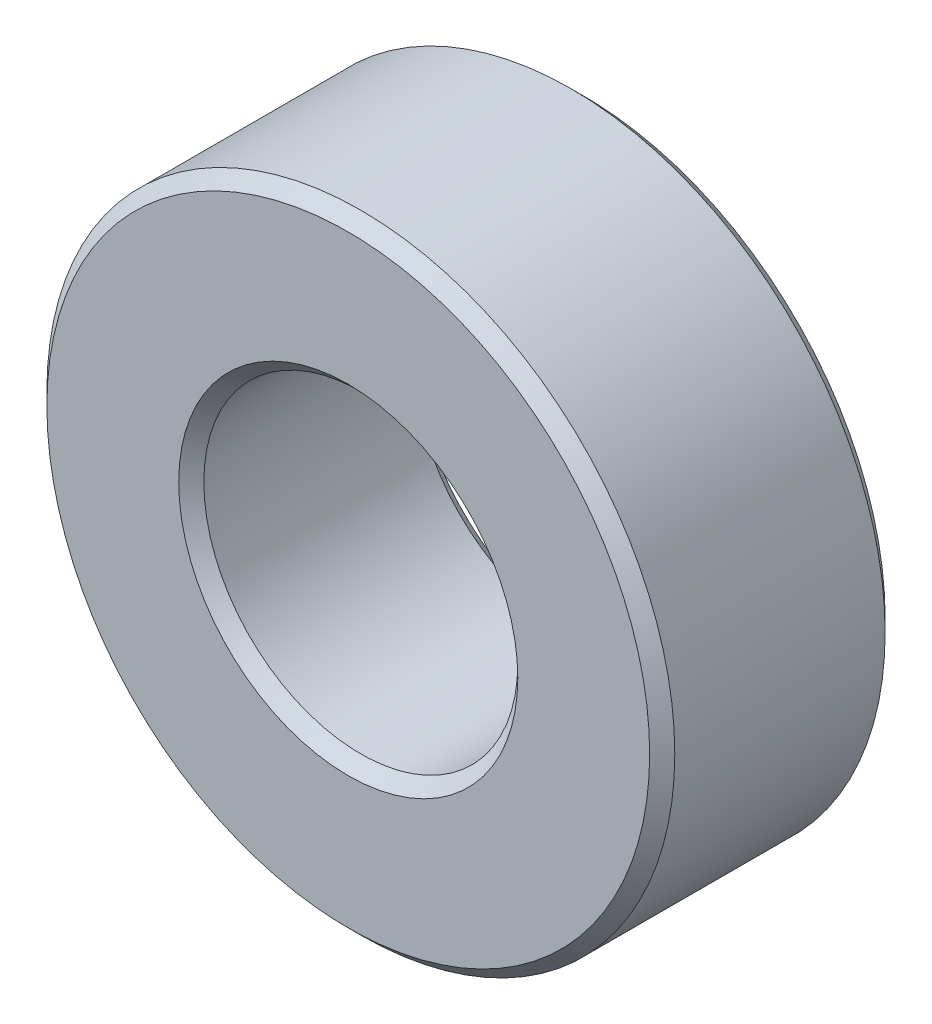
ISO-10303-21;
HEADER;
FILE_DESCRIPTION(('STEP AP214'),'2;1');
FILE_NAME('part.step','',(''),(''),'','','');
FILE_SCHEMA(('AUTOMOTIVE_DESIGN { 1 0 10303 214 1 1 1 1 }'));
ENDSEC;
DATA;
#1=APPLICATION_CONTEXT('core data for automotive mechanical design processes');
#2=APPLICATION_PROTOCOL_DEFINITION('international standard','automotive_design',2000,#1);
#3=PRODUCT_CONTEXT('',#1,'mechanical');
#4=PRODUCT('Part','Part','',(#3));
#5=PRODUCT_RELATED_PRODUCT_CATEGORY('part','',(#4));
#6=PRODUCT_DEFINITION_FORMATION('','',#4);
#7=PRODUCT_DEFINITION_CONTEXT('part definition',#1,'design');
#8=PRODUCT_DEFINITION('design','',#6,#7);
#9=PRODUCT_DEFINITION_SHAPE('','',#8);
#10=(LENGTH_UNIT() NAMED_UNIT(*) SI_UNIT(.MILLI.,.METRE.));
#11=(NAMED_UNIT(*) PLANE_ANGLE_UNIT() SI_UNIT($,.RADIAN.));
#12=(NAMED_UNIT(*) SI_UNIT($,.STERADIAN.) SOLID_ANGLE_UNIT());
#13=UNCERTAINTY_MEASURE_WITH_UNIT(LENGTH_MEASURE(1.E-05),#10,'distance_accuracy_value','');
#14=(GEOMETRIC_REPRESENTATION_CONTEXT(3) GLOBAL_UNCERTAINTY_ASSIGNED_CONTEXT((#13)) GLOBAL_UNIT_ASSIGNED_CONTEXT((#10,
#11,#12)) REPRESENTATION_CONTEXT('',''));
#15=CARTESIAN_POINT('',(0.,0.,0.));
#16=DIRECTION('',(0.,0.,1.));
#17=DIRECTION('',(1.,0.,0.));
#18=AXIS2_PLACEMENT_3D('',#15,#16,#17);
#19=CARTESIAN_POINT('',(0.,0.,4.7625));
#20=DIRECTION('',(0.,0.,1.));
#21=DIRECTION('',(1.,0.,0.));
#22=AXIS2_PLACEMENT_3D('',#19,#20,#21);
#23=PLANE('',#22);
#24=CARTESIAN_POINT('',(0.,0.,4.7625));
#25=DIRECTION('',(0.,0.,1.));
#26=DIRECTION('',(1.,0.,0.));
#27=AXIS2_PLACEMENT_3D('',#24,#25,#26);
#28=CIRCLE('',#27,3.42900000000001);
#29=CARTESIAN_POINT('',(3.42900000000001,0.,4.7625));
#30=VERTEX_POINT('',#29);
#31=EDGE_CURVE('E50',#30,#30,#28,.F.);
#32=ORIENTED_EDGE('',*,*,#31,.T.);
#33=EDGE_LOOP('',(#32));
#34=FACE_BOUND('',#33,.T.);
#35=CARTESIAN_POINT('',(0.,0.,4.7625));
#36=DIRECTION('',(0.,0.,1.));
#37=DIRECTION('',(1.,0.,0.));
#38=AXIS2_PLACEMENT_3D('',#35,#36,#37);
#39=CIRCLE('',#38,6.09600000000001);
#40=CARTESIAN_POINT('',(6.09600000000001,0.,4.7625));
#41=VERTEX_POINT('',#40);
#42=EDGE_CURVE('E54',#41,#41,#39,.T.);
#43=ORIENTED_EDGE('',*,*,#42,.T.);
#44=EDGE_LOOP('',(#43));
#45=FACE_BOUND('',#44,.T.);
#46=ADVANCED_FACE('F38',(#34,#45),#23,.T.);
#47=CARTESIAN_POINT('',(0.,0.,0.));
#48=DIRECTION('',(0.,0.,1.));
#49=DIRECTION('',(1.,0.,0.));
#50=AXIS2_PLACEMENT_3D('',#47,#48,#49);
#51=PLANE('',#50);
#52=CARTESIAN_POINT('',(0.,0.,0.));
#53=DIRECTION('',(0.,0.,1.));
#54=DIRECTION('',(1.,0.,0.));
#55=AXIS2_PLACEMENT_3D('',#52,#53,#54);
#56=CIRCLE('',#55,3.429);
#57=CARTESIAN_POINT('',(3.429,0.,0.));
#58=VERTEX_POINT('',#57);
#59=EDGE_CURVE('E65',#58,#58,#56,.T.);
#60=ORIENTED_EDGE('',*,*,#59,.T.);
#61=EDGE_LOOP('',(#60));
#62=FACE_BOUND('',#61,.T.);
#63=CARTESIAN_POINT('',(0.,0.,0.));
#64=DIRECTION('',(0.,0.,1.));
#65=DIRECTION('',(1.,0.,0.));
#66=AXIS2_PLACEMENT_3D('',#63,#64,#65);
#67=CIRCLE('',#66,6.09599999999999);
#68=CARTESIAN_POINT('',(6.09599999999999,0.,0.));
#69=VERTEX_POINT('',#68);
#70=EDGE_CURVE('E68',#69,#69,#67,.F.);
#71=ORIENTED_EDGE('',*,*,#70,.T.);
#72=EDGE_LOOP('',(#71));
#73=FACE_BOUND('',#72,.T.);
#74=ADVANCED_FACE('F72',(#62,#73),#51,.F.);
#75=CARTESIAN_POINT('',(0.,0.,4.7625));
#76=DIRECTION('',(0.,0.,-1.));
#77=DIRECTION('',(-1.,0.,0.));
#78=AXIS2_PLACEMENT_3D('',#75,#76,#77);
#79=CYLINDRICAL_SURFACE('',#78,6.35);
#80=CARTESIAN_POINT('',(0.,0.,0.254000000000012));
#81=DIRECTION('',(0.,0.,1.));
#82=DIRECTION('',(1.,0.,0.));
#83=AXIS2_PLACEMENT_3D('',#80,#81,#82);
#84=CIRCLE('',#83,6.35);
#85=CARTESIAN_POINT('',(-6.35,0.,0.254000000000011));
#86=VERTEX_POINT('',#85);
#87=EDGE_CURVE('E10',#86,#86,#84,.T.);
#88=CARTESIAN_POINT('',(0.,0.,4.50850000000001));
#89=DIRECTION('',(0.,0.,1.));
#90=DIRECTION('',(1.,0.,0.));
#91=AXIS2_PLACEMENT_3D('',#88,#89,#90);
#92=CIRCLE('',#91,6.35);
#93=CARTESIAN_POINT('',(-6.35,0.,4.50850000000001));
#94=VERTEX_POINT('',#93);
#95=EDGE_CURVE('E46',#94,#94,#92,.F.);
#96=CARTESIAN_POINT('',(-6.35,0.,0.254000000000011));
#97=CARTESIAN_POINT('',(-6.35,0.,0.298317708333344));
#98=CARTESIAN_POINT('',(-6.35,0.,0.342635416666678));
#99=CARTESIAN_POINT('',(-6.35,0.,0.431270833333344));
#100=CARTESIAN_POINT('',(-6.35,0.,0.475588541666678));
#101=CARTESIAN_POINT('',(-6.35,0.,0.564223958333344));
#102=CARTESIAN_POINT('',(-6.35,0.,0.608541666666678));
#103=CARTESIAN_POINT('',(-6.35,0.,0.697177083333345));
#104=CARTESIAN_POINT('',(-6.35,0.,0.741494791666678));
#105=CARTESIAN_POINT('',(-6.35,0.,0.830130208333344));
#106=CARTESIAN_POINT('',(-6.35,0.,0.874447916666678));
#107=CARTESIAN_POINT('',(-6.35,0.,0.963083333333344));
#108=CARTESIAN_POINT('',(-6.35,0.,1.00740104166668));
#109=CARTESIAN_POINT('',(-6.35,0.,1.09603645833334));
#110=CARTESIAN_POINT('',(-6.35,0.,1.14035416666668));
#111=CARTESIAN_POINT('',(-6.35,0.,1.22898958333334));
#112=CARTESIAN_POINT('',(-6.35,0.,1.27330729166668));
#113=CARTESIAN_POINT('',(-6.35,0.,1.36194270833334));
#114=CARTESIAN_POINT('',(-6.35,0.,1.40626041666668));
#115=CARTESIAN_POINT('',(-6.35,0.,1.49489583333334));
#116=CARTESIAN_POINT('',(-6.35,0.,1.53921354166668));
#117=CARTESIAN_POINT('',(-6.35,0.,1.62784895833334));
#118=CARTESIAN_POINT('',(-6.35,0.,1.67216666666668));
#119=CARTESIAN_POINT('',(-6.35,0.,1.76080208333334));
#120=CARTESIAN_POINT('',(-6.35,0.,1.80511979166668));
#121=CARTESIAN_POINT('',(-6.35,0.,1.89375520833334));
#122=CARTESIAN_POINT('',(-6.35,0.,1.93807291666668));
#123=CARTESIAN_POINT('',(-6.35,0.,2.02670833333334));
#124=CARTESIAN_POINT('',(-6.35,0.,2.07102604166668));
#125=CARTESIAN_POINT('',(-6.35,0.,2.15966145833334));
#126=CARTESIAN_POINT('',(-6.35,0.,2.20397916666668));
#127=CARTESIAN_POINT('',(-6.35,0.,2.29261458333334));
#128=CARTESIAN_POINT('',(-6.35,0.,2.33693229166668));
#129=CARTESIAN_POINT('',(-6.35,0.,2.42556770833334));
#130=CARTESIAN_POINT('',(-6.35,0.,2.46988541666668));
#131=CARTESIAN_POINT('',(-6.35,0.,2.55852083333334));
#132=CARTESIAN_POINT('',(-6.35,0.,2.60283854166668));
#133=CARTESIAN_POINT('',(-6.35,0.,2.69147395833334));
#134=CARTESIAN_POINT('',(-6.35,0.,2.73579166666668));
#135=CARTESIAN_POINT('',(-6.35,0.,2.82442708333334));
#136=CARTESIAN_POINT('',(-6.35,0.,2.86874479166668));
#137=CARTESIAN_POINT('',(-6.35,0.,2.95738020833334));
#138=CARTESIAN_POINT('',(-6.35,0.,3.00169791666668));
#139=CARTESIAN_POINT('',(-6.35,0.,3.09033333333334));
#140=CARTESIAN_POINT('',(-6.35,0.,3.13465104166668));
#141=CARTESIAN_POINT('',(-6.35,0.,3.22328645833334));
#142=CARTESIAN_POINT('',(-6.35,0.,3.26760416666668));
#143=CARTESIAN_POINT('',(-6.35,0.,3.35623958333334));
#144=CARTESIAN_POINT('',(-6.35,0.,3.40055729166668));
#145=CARTESIAN_POINT('',(-6.35,0.,3.48919270833334));
#146=CARTESIAN_POINT('',(-6.35,0.,3.53351041666668));
#147=CARTESIAN_POINT('',(-6.35,0.,3.62214583333334));
#148=CARTESIAN_POINT('',(-6.35,0.,3.66646354166668));
#149=CARTESIAN_POINT('',(-6.35,0.,3.75509895833334));
#150=CARTESIAN_POINT('',(-6.35,0.,3.79941666666668));
#151=CARTESIAN_POINT('',(-6.35,0.,3.88805208333334));
#152=CARTESIAN_POINT('',(-6.35,0.,3.93236979166668));
#153=CARTESIAN_POINT('',(-6.35,0.,4.02100520833334));
#154=CARTESIAN_POINT('',(-6.35,0.,4.06532291666668));
#155=CARTESIAN_POINT('',(-6.35,0.,4.15395833333334));
#156=CARTESIAN_POINT('',(-6.35,0.,4.19827604166668));
#157=CARTESIAN_POINT('',(-6.35,0.,4.28691145833334));
#158=CARTESIAN_POINT('',(-6.35,0.,4.33122916666668));
#159=CARTESIAN_POINT('',(-6.35,0.,4.41986458333334));
#160=CARTESIAN_POINT('',(-6.35,0.,4.46418229166668));
#161=CARTESIAN_POINT('',(-6.35,0.,4.50850000000001));
#162=B_SPLINE_CURVE_WITH_KNOTS('',3,(#96,#97,#98,#99,#100,#101,#102,#103,#104,#105,#106,#107,
#108,#109,#110,#111,#112,#113,#114,#115,#116,#117,#118,#119,#120,#121,#122,#123,#124,#125,#126,
#127,#128,#129,#130,#131,#132,#133,#134,#135,#136,#137,#138,#139,#140,#141,#142,#143,#144,#145,
#146,#147,#148,#149,#150,#151,#152,#153,#154,#155,#156,#157,#158,#159,#160,#161),.UNSPECIFIED.,
.F.,.F.,(4,2,2,2,2,2,2,2,2,2,2,2,2,2,2,2,2,2,2,2,2,2,2,2,2,2,2,2,2,2,2,2,4),(0.,0.132953125,
0.26590625,0.398859375,0.5318125,0.664765625,0.797718749999999,0.930671874999999,1.063625,
1.196578125,1.32953125,1.462484375,1.5954375,1.728390625,1.86134375,1.994296875,2.12725,
2.260203125,2.39315625,2.526109375,2.6590625,2.792015625,2.92496875,3.057921875,3.190875,
3.323828125,3.45678125,3.589734375,3.7226875,3.855640625,3.98859375,4.121546875,4.2545),.UNSPECIFIED.);
#163=EDGE_CURVE('BSEAM93',#86,#94,#162,.T.);
#164=ORIENTED_EDGE('',*,*,#87,.T.);
#165=ORIENTED_EDGE('',*,*,#95,.T.);
#166=ORIENTED_EDGE('',*,*,#163,.T.);
#167=ORIENTED_EDGE('',*,*,#163,.F.);
#168=EDGE_LOOP('',(#164,#166,#165,#167));
#169=FACE_BOUND('',#168,.T.);
#170=ADVANCED_FACE('F93',(#169),#79,.T.);
#171=CARTESIAN_POINT('',(0.,0.,4.7625));
#172=DIRECTION('',(0.,0.,-1.));
#173=DIRECTION('',(-1.,0.,0.));
#174=AXIS2_PLACEMENT_3D('',#171,#172,#173);
#175=CYLINDRICAL_SURFACE('',#174,3.175);
#176=CARTESIAN_POINT('',(0.,0.,0.253999999999996));
#177=DIRECTION('',(0.,0.,1.));
#178=DIRECTION('',(1.,0.,0.));
#179=AXIS2_PLACEMENT_3D('',#176,#177,#178);
#180=CIRCLE('',#179,3.175);
#181=CARTESIAN_POINT('',(-3.175,0.,0.253999999999996));
#182=VERTEX_POINT('',#181);
#183=EDGE_CURVE('E59',#182,#182,#180,.F.);
#184=CARTESIAN_POINT('',(0.,0.,4.50849999999999));
#185=DIRECTION('',(0.,0.,1.));
#186=DIRECTION('',(1.,0.,0.));
#187=AXIS2_PLACEMENT_3D('',#184,#185,#186);
#188=CIRCLE('',#187,3.175);
#189=CARTESIAN_POINT('',(-3.175,0.,4.50849999999999));
#190=VERTEX_POINT('',#189);
#191=EDGE_CURVE('E62',#190,#190,#188,.T.);
#192=CARTESIAN_POINT('',(-3.175,0.,0.253999999999996));
#193=CARTESIAN_POINT('',(-3.175,0.,0.298317708333329));
#194=CARTESIAN_POINT('',(-3.175,0.,0.342635416666662));
#195=CARTESIAN_POINT('',(-3.175,0.,0.431270833333329));
#196=CARTESIAN_POINT('',(-3.175,0.,0.475588541666662));
#197=CARTESIAN_POINT('',(-3.175,0.,0.564223958333329));
#198=CARTESIAN_POINT('',(-3.175,0.,0.608541666666662));
#199=CARTESIAN_POINT('',(-3.175,0.,0.697177083333328));
#200=CARTESIAN_POINT('',(-3.175,0.,0.741494791666662));
#201=CARTESIAN_POINT('',(-3.175,0.,0.830130208333328));
#202=CARTESIAN_POINT('',(-3.175,0.,0.874447916666661));
#203=CARTESIAN_POINT('',(-3.175,0.,0.963083333333327));
#204=CARTESIAN_POINT('',(-3.175,0.,1.00740104166666));
#205=CARTESIAN_POINT('',(-3.175,0.,1.09603645833333));
#206=CARTESIAN_POINT('',(-3.175,0.,1.14035416666666));
#207=CARTESIAN_POINT('',(-3.175,0.,1.22898958333333));
#208=CARTESIAN_POINT('',(-3.175,0.,1.27330729166666));
#209=CARTESIAN_POINT('',(-3.175,0.,1.36194270833333));
#210=CARTESIAN_POINT('',(-3.175,0.,1.40626041666666));
#211=CARTESIAN_POINT('',(-3.175,0.,1.49489583333333));
#212=CARTESIAN_POINT('',(-3.175,0.,1.53921354166666));
#213=CARTESIAN_POINT('',(-3.175,0.,1.62784895833333));
#214=CARTESIAN_POINT('',(-3.175,0.,1.67216666666666));
#215=CARTESIAN_POINT('',(-3.175,0.,1.76080208333333));
#216=CARTESIAN_POINT('',(-3.175,0.,1.80511979166666));
#217=CARTESIAN_POINT('',(-3.175,0.,1.89375520833333));
#218=CARTESIAN_POINT('',(-3.175,0.,1.93807291666666));
#219=CARTESIAN_POINT('',(-3.175,0.,2.02670833333333));
#220=CARTESIAN_POINT('',(-3.175,0.,2.07102604166666));
#221=CARTESIAN_POINT('',(-3.175,0.,2.15966145833332));
#222=CARTESIAN_POINT('',(-3.175,0.,2.20397916666666));
#223=CARTESIAN_POINT('',(-3.175,0.,2.29261458333332));
#224=CARTESIAN_POINT('',(-3.175,0.,2.33693229166666));
#225=CARTESIAN_POINT('',(-3.175,0.,2.42556770833332));
#226=CARTESIAN_POINT('',(-3.175,0.,2.46988541666666));
#227=CARTESIAN_POINT('',(-3.175,0.,2.55852083333332));
#228=CARTESIAN_POINT('',(-3.175,0.,2.60283854166666));
#229=CARTESIAN_POINT('',(-3.175,0.,2.69147395833332));
#230=CARTESIAN_POINT('',(-3.175,0.,2.73579166666666));
#231=CARTESIAN_POINT('',(-3.175,0.,2.82442708333332));
#232=CARTESIAN_POINT('',(-3.175,0.,2.86874479166666));
#233=CARTESIAN_POINT('',(-3.175,0.,2.95738020833332));
#234=CARTESIAN_POINT('',(-3.175,0.,3.00169791666666));
#235=CARTESIAN_POINT('',(-3.175,0.,3.09033333333332));
#236=CARTESIAN_POINT('',(-3.175,0.,3.13465104166666));
#237=CARTESIAN_POINT('',(-3.175,0.,3.22328645833332));
#238=CARTESIAN_POINT('',(-3.175,0.,3.26760416666666));
#239=CARTESIAN_POINT('',(-3.175,0.,3.35623958333332));
#240=CARTESIAN_POINT('',(-3.175,0.,3.40055729166666));
#241=CARTESIAN_POINT('',(-3.175,0.,3.48919270833332));
#242=CARTESIAN_POINT('',(-3.175,0.,3.53351041666666));
#243=CARTESIAN_POINT('',(-3.175,0.,3.62214583333332));
#244=CARTESIAN_POINT('',(-3.175,0.,3.66646354166666));
#245=CARTESIAN_POINT('',(-3.175,0.,3.75509895833332));
#246=CARTESIAN_POINT('',(-3.175,0.,3.79941666666666));
#247=CARTESIAN_POINT('',(-3.175,0.,3.88805208333332));
#248=CARTESIAN_POINT('',(-3.175,0.,3.93236979166665));
#249=CARTESIAN_POINT('',(-3.175,0.,4.02100520833332));
#250=CARTESIAN_POINT('',(-3.175,0.,4.06532291666665));
#251=CARTESIAN_POINT('',(-3.175,0.,4.15395833333332));
#252=CARTESIAN_POINT('',(-3.175,0.,4.19827604166665));
#253=CARTESIAN_POINT('',(-3.175,0.,4.28691145833332));
#254=CARTESIAN_POINT('',(-3.175,0.,4.33122916666665));
#255=CARTESIAN_POINT('',(-3.175,0.,4.41986458333332));
#256=CARTESIAN_POINT('',(-3.175,0.,4.46418229166665));
#257=CARTESIAN_POINT('',(-3.175,0.,4.50849999999999));
#258=B_SPLINE_CURVE_WITH_KNOTS('',3,(#192,#193,#194,#195,#196,#197,#198,#199,#200,#201,#202,
#203,#204,#205,#206,#207,#208,#209,#210,#211,#212,#213,#214,#215,#216,#217,#218,#219,#220,#221,
#222,#223,#224,#225,#226,#227,#228,#229,#230,#231,#232,#233,#234,#235,#236,#237,#238,#239,#240,
#241,#242,#243,#244,#245,#246,#247,#248,#249,#250,#251,#252,#253,#254,#255,#256,#257),
.UNSPECIFIED.,.F.,.F.,(4,2,2,2,2,2,2,2,2,2,2,2,2,2,2,2,2,2,2,2,2,2,2,2,2,2,2,2,2,2,2,2,4),(0.,
0.132953125,0.26590625,0.398859374999999,0.531812499999999,0.664765624999999,0.797718749999998,
0.930671874999998,1.063625,1.196578125,1.32953125,1.462484375,1.5954375,1.728390625,1.86134375,
1.994296875,2.12725,2.260203125,2.39315625,2.526109375,2.65906249999999,2.79201562499999,
2.92496874999999,3.05792187499999,3.19087499999999,3.32382812499999,3.45678124999999,
3.58973437499999,3.72268749999999,3.85564062499999,3.98859374999999,4.12154687499999,
4.25449999999999),.UNSPECIFIED.);
#259=EDGE_CURVE('BSEAM98',#182,#190,#258,.T.);
#260=ORIENTED_EDGE('',*,*,#183,.T.);
#261=ORIENTED_EDGE('',*,*,#191,.T.);
#262=ORIENTED_EDGE('',*,*,#259,.T.);
#263=ORIENTED_EDGE('',*,*,#259,.F.);
#264=EDGE_LOOP('',(#260,#262,#261,#263));
#265=FACE_BOUND('',#264,.T.);
#266=ADVANCED_FACE('F98',(#265),#175,.F.);
#267=CARTESIAN_POINT('',(0.,0.,0.));
#268=DIRECTION('',(0.,0.,-1.));
#269=DIRECTION('',(-1.,0.,0.));
#270=AXIS2_PLACEMENT_3D('',#267,#268,#269);
#271=CONICAL_SURFACE('',#270,3.429,0.785398163397449);
#272=ORIENTED_EDGE('',*,*,#183,.F.);
#273=EDGE_LOOP('',(#272));
#274=FACE_BOUND('',#273,.T.);
#275=ORIENTED_EDGE('',*,*,#59,.F.);
#276=EDGE_LOOP('',(#275));
#277=FACE_BOUND('',#276,.T.);
#278=ADVANCED_FACE('F83',(#274,#277),#271,.F.);
#279=CARTESIAN_POINT('',(0.,0.,4.50849999999999));
#280=DIRECTION('',(0.,0.,1.));
#281=DIRECTION('',(1.,0.,0.));
#282=AXIS2_PLACEMENT_3D('',#279,#280,#281);
#283=CONICAL_SURFACE('',#282,3.175,0.785398163397444);
#284=ORIENTED_EDGE('',*,*,#31,.F.);
#285=EDGE_LOOP('',(#284));
#286=FACE_BOUND('',#285,.T.);
#287=ORIENTED_EDGE('',*,*,#191,.F.);
#288=EDGE_LOOP('',(#287));
#289=FACE_BOUND('',#288,.T.);
#290=ADVANCED_FACE('F77',(#286,#289),#283,.F.);
#291=CARTESIAN_POINT('',(0.,0.,0.254000000000012));
#292=DIRECTION('',(0.,0.,1.));
#293=DIRECTION('',(1.,0.,0.));
#294=AXIS2_PLACEMENT_3D('',#291,#292,#293);
#295=CONICAL_SURFACE('',#294,6.35,0.78539816339745);
#296=ORIENTED_EDGE('',*,*,#70,.F.);
#297=EDGE_LOOP('',(#296));
#298=FACE_BOUND('',#297,.T.);
#299=ORIENTED_EDGE('',*,*,#87,.F.);
#300=EDGE_LOOP('',(#299));
#301=FACE_BOUND('',#300,.T.);
#302=ADVANCED_FACE('F74',(#298,#301),#295,.T.);
#303=CARTESIAN_POINT('',(0.,0.,4.7625));
#304=DIRECTION('',(0.,0.,-1.));
#305=DIRECTION('',(-1.,0.,0.));
#306=AXIS2_PLACEMENT_3D('',#303,#304,#305);
#307=CONICAL_SURFACE('',#306,6.09600000000001,0.785398163397453);
#308=ORIENTED_EDGE('',*,*,#95,.F.);
#309=EDGE_LOOP('',(#308));
#310=FACE_BOUND('',#309,.T.);
#311=ORIENTED_EDGE('',*,*,#42,.F.);
#312=EDGE_LOOP('',(#311));
#313=FACE_BOUND('',#312,.T.);
#314=ADVANCED_FACE('F41',(#310,#313),#307,.T.);
#315=CLOSED_SHELL('',(#46,#74,#170,#266,#278,#290,#302,#314));
#316=MANIFOLD_SOLID_BREP('B2',#315);
#317=ADVANCED_BREP_SHAPE_REPRESENTATION('',(#18,#316),#14);
#318=SHAPE_DEFINITION_REPRESENTATION(#9,#317);
ENDSEC;
END-ISO-10303-21;
